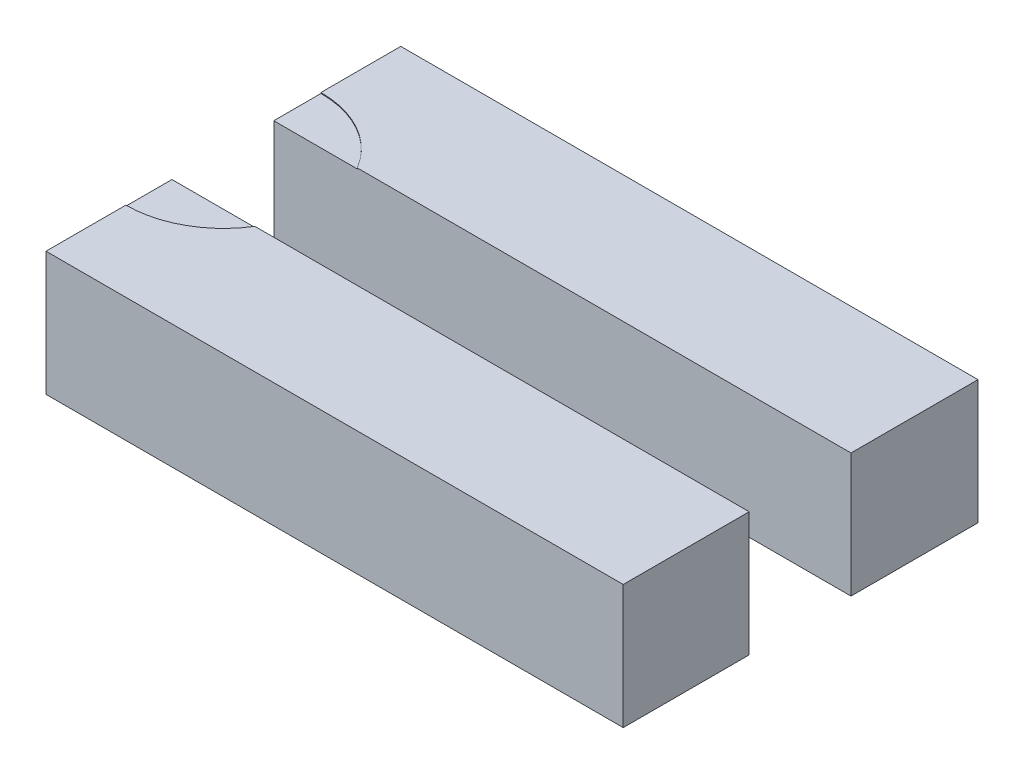
ISO-10303-21;
HEADER;
FILE_DESCRIPTION(('STEP AP214'),'2;1');
FILE_NAME('part.step','',(''),(''),'','','');
FILE_SCHEMA(('AUTOMOTIVE_DESIGN { 1 0 10303 214 1 1 1 1 }'));
ENDSEC;
DATA;
#1=APPLICATION_CONTEXT('core data for automotive mechanical design processes');
#2=APPLICATION_PROTOCOL_DEFINITION('international standard','automotive_design',2000,#1);
#3=PRODUCT_CONTEXT('',#1,'mechanical');
#4=PRODUCT('Part','Part','',(#3));
#5=PRODUCT_RELATED_PRODUCT_CATEGORY('part','',(#4));
#6=PRODUCT_DEFINITION_FORMATION('','',#4);
#7=PRODUCT_DEFINITION_CONTEXT('part definition',#1,'design');
#8=PRODUCT_DEFINITION('design','',#6,#7);
#9=PRODUCT_DEFINITION_SHAPE('','',#8);
#10=(LENGTH_UNIT() NAMED_UNIT(*) SI_UNIT(.MILLI.,.METRE.));
#11=(NAMED_UNIT(*) PLANE_ANGLE_UNIT() SI_UNIT($,.RADIAN.));
#12=(NAMED_UNIT(*) SI_UNIT($,.STERADIAN.) SOLID_ANGLE_UNIT());
#13=UNCERTAINTY_MEASURE_WITH_UNIT(LENGTH_MEASURE(1.E-05),#10,'distance_accuracy_value','');
#14=(GEOMETRIC_REPRESENTATION_CONTEXT(3) GLOBAL_UNCERTAINTY_ASSIGNED_CONTEXT((#13)) GLOBAL_UNIT_ASSIGNED_CONTEXT((#10,
#11,#12)) REPRESENTATION_CONTEXT('',''));
#15=CARTESIAN_POINT('',(0.,0.,0.));
#16=DIRECTION('',(0.,0.,1.));
#17=DIRECTION('',(1.,0.,0.));
#18=AXIS2_PLACEMENT_3D('',#15,#16,#17);
#19=CARTESIAN_POINT('',(-41.3258,9.5758,-12.7));
#20=DIRECTION('',(0.,0.,1.));
#21=DIRECTION('',(1.,0.,0.));
#22=AXIS2_PLACEMENT_3D('',#19,#20,#21);
#23=PLANE('',#22);
#24=DIRECTION('',(0.,-1.,0.));
#25=VECTOR('',#24,1.);
#26=CARTESIAN_POINT('',(0.,9.5758,-12.7));
#27=LINE('',#26,#25);
#28=CARTESIAN_POINT('',(0.,8.8773,-12.7));
#29=VERTEX_POINT('',#28);
#30=CARTESIAN_POINT('',(0.,0.,-12.7));
#31=VERTEX_POINT('',#30);
#32=EDGE_CURVE('E12',#29,#31,#27,.T.);
#33=ORIENTED_EDGE('',*,*,#32,.F.);
#34=DIRECTION('',(-1.,0.,0.));
#35=VECTOR('',#34,1.);
#36=CARTESIAN_POINT('',(-41.3258,8.8773,-12.7));
#37=LINE('',#36,#35);
#38=CARTESIAN_POINT('',(41.3258,8.8773,-12.7));
#39=VERTEX_POINT('',#38);
#40=EDGE_CURVE('E105',#39,#29,#37,.T.);
#41=ORIENTED_EDGE('',*,*,#40,.F.);
#42=DIRECTION('',(0.,-1.,0.));
#43=VECTOR('',#42,1.);
#44=CARTESIAN_POINT('',(41.3258,9.5758,-12.7));
#45=LINE('',#44,#43);
#46=CARTESIAN_POINT('',(41.3258,0.,-12.7));
#47=VERTEX_POINT('',#46);
#48=EDGE_CURVE('E117',#39,#47,#45,.T.);
#49=ORIENTED_EDGE('',*,*,#48,.T.);
#50=DIRECTION('',(-1.,0.,0.));
#51=VECTOR('',#50,1.);
#52=CARTESIAN_POINT('',(-41.3258,0.,-12.7));
#53=LINE('',#52,#51);
#54=EDGE_CURVE('E126',#47,#31,#53,.T.);
#55=ORIENTED_EDGE('',*,*,#54,.T.);
#56=EDGE_LOOP('',(#33,#41,#49,#55));
#57=FACE_BOUND('',#56,.T.);
#58=ADVANCED_FACE('F45',(#57),#23,.F.);
#59=CARTESIAN_POINT('',(0.,8.81379999999999,0.));
#60=DIRECTION('',(0.,1.,0.));
#61=DIRECTION('',(0.,0.,1.));
#62=AXIS2_PLACEMENT_3D('',#59,#60,#61);
#63=CYLINDRICAL_SURFACE('',#62,6.985);
#64=DIRECTION('',(0.,1.,0.));
#65=VECTOR('',#64,1.);
#66=CARTESIAN_POINT('',(0.,8.81379999999999,-6.985));
#67=LINE('',#66,#65);
#68=CARTESIAN_POINT('',(0.,8.81379999999999,-6.985));
#69=VERTEX_POINT('',#68);
#70=CARTESIAN_POINT('',(0.,8.8773,-6.985));
#71=VERTEX_POINT('',#70);
#72=EDGE_CURVE('E55',#69,#71,#67,.T.);
#73=ORIENTED_EDGE('',*,*,#72,.F.);
#74=CARTESIAN_POINT('',(0.,8.81379999999999,0.));
#75=DIRECTION('',(0.,1.,0.));
#76=DIRECTION('',(0.,0.,1.));
#77=AXIS2_PLACEMENT_3D('',#74,#75,#76);
#78=CIRCLE('',#77,6.985);
#79=CARTESIAN_POINT('',(5.98174044572314,8.81379999999999,-3.6068));
#80=VERTEX_POINT('',#79);
#81=EDGE_CURVE('E143',#80,#69,#78,.T.);
#82=ORIENTED_EDGE('',*,*,#81,.F.);
#83=DIRECTION('',(0.,1.,0.));
#84=VECTOR('',#83,1.);
#85=CARTESIAN_POINT('',(5.98174044572314,8.81379999999999,-3.6068));
#86=LINE('',#85,#84);
#87=CARTESIAN_POINT('',(5.98174044572314,8.8773,-3.6068));
#88=VERTEX_POINT('',#87);
#89=EDGE_CURVE('E111',#88,#80,#86,.F.);
#90=ORIENTED_EDGE('',*,*,#89,.F.);
#91=CARTESIAN_POINT('',(0.,8.8773,0.));
#92=DIRECTION('',(0.,1.,0.));
#93=DIRECTION('',(0.,0.,1.));
#94=AXIS2_PLACEMENT_3D('',#91,#92,#93);
#95=CIRCLE('',#94,6.985);
#96=EDGE_CURVE('E137',#71,#88,#95,.F.);
#97=ORIENTED_EDGE('',*,*,#96,.F.);
#98=EDGE_LOOP('',(#73,#82,#90,#97));
#99=FACE_BOUND('',#98,.T.);
#100=ADVANCED_FACE('F153',(#99),#63,.F.);
#101=CARTESIAN_POINT('',(0.,0.,0.));
#102=DIRECTION('',(0.,-1.,0.));
#103=DIRECTION('',(0.,0.,-1.));
#104=AXIS2_PLACEMENT_3D('',#101,#102,#103);
#105=PLANE('',#104);
#106=DIRECTION('',(-1.,0.,0.));
#107=VECTOR('',#106,1.);
#108=CARTESIAN_POINT('',(-9.47420000000001,0.,-3.6068));
#109=LINE('',#108,#107);
#110=CARTESIAN_POINT('',(41.3258,0.,-3.6068));
#111=VERTEX_POINT('',#110);
#112=CARTESIAN_POINT('',(0.,0.,-3.6068));
#113=VERTEX_POINT('',#112);
#114=EDGE_CURVE('E87',#111,#113,#109,.T.);
#115=ORIENTED_EDGE('',*,*,#114,.T.);
#116=DIRECTION('',(0.,0.,-1.));
#117=VECTOR('',#116,1.);
#118=CARTESIAN_POINT('',(0.,0.,0.));
#119=LINE('',#118,#117);
#120=EDGE_CURVE('E63',#113,#31,#119,.T.);
#121=ORIENTED_EDGE('',*,*,#120,.T.);
#122=ORIENTED_EDGE('',*,*,#54,.F.);
#123=DIRECTION('',(0.,0.,-1.));
#124=VECTOR('',#123,1.);
#125=CARTESIAN_POINT('',(41.3258,0.,12.7));
#126=LINE('',#125,#124);
#127=EDGE_CURVE('E124',#111,#47,#126,.T.);
#128=ORIENTED_EDGE('',*,*,#127,.F.);
#129=EDGE_LOOP('',(#115,#121,#122,#128));
#130=FACE_BOUND('',#129,.T.);
#131=ADVANCED_FACE('F146',(#130),#105,.T.);
#132=CARTESIAN_POINT('',(0.,8.81379999999999,0.));
#133=DIRECTION('',(0.,1.,0.));
#134=DIRECTION('',(0.,0.,1.));
#135=AXIS2_PLACEMENT_3D('',#132,#133,#134);
#136=PLANE('',#135);
#137=ORIENTED_EDGE('',*,*,#81,.T.);
#138=DIRECTION('',(0.,0.,1.));
#139=VECTOR('',#138,1.);
#140=CARTESIAN_POINT('',(0.,8.81379999999999,0.));
#141=LINE('',#140,#139);
#142=CARTESIAN_POINT('',(0.,8.81379999999999,-3.6068));
#143=VERTEX_POINT('',#142);
#144=EDGE_CURVE('E49',#69,#143,#141,.T.);
#145=ORIENTED_EDGE('',*,*,#144,.T.);
#146=DIRECTION('',(1.,0.,0.));
#147=VECTOR('',#146,1.);
#148=CARTESIAN_POINT('',(-9.47420000000001,8.81379999999999,-3.6068));
#149=LINE('',#148,#147);
#150=EDGE_CURVE('E120',#143,#80,#149,.T.);
#151=ORIENTED_EDGE('',*,*,#150,.T.);
#152=EDGE_LOOP('',(#137,#145,#151));
#153=FACE_BOUND('',#152,.T.);
#154=ADVANCED_FACE('F155',(#153),#136,.T.);
#155=CARTESIAN_POINT('',(0.,8.8773,0.));
#156=DIRECTION('',(0.,1.,0.));
#157=DIRECTION('',(0.,0.,1.));
#158=AXIS2_PLACEMENT_3D('',#155,#156,#157);
#159=PLANE('',#158);
#160=ORIENTED_EDGE('',*,*,#40,.T.);
#161=DIRECTION('',(0.,0.,1.));
#162=VECTOR('',#161,1.);
#163=CARTESIAN_POINT('',(0.,8.8773,0.));
#164=LINE('',#163,#162);
#165=EDGE_CURVE('E119',#29,#71,#164,.T.);
#166=ORIENTED_EDGE('',*,*,#165,.T.);
#167=ORIENTED_EDGE('',*,*,#96,.T.);
#168=DIRECTION('',(1.,0.,0.));
#169=VECTOR('',#168,1.);
#170=CARTESIAN_POINT('',(-9.47420000000001,8.8773,-3.6068));
#171=LINE('',#170,#169);
#172=CARTESIAN_POINT('',(41.3258,8.8773,-3.60679999999999));
#173=VERTEX_POINT('',#172);
#174=EDGE_CURVE('E108',#88,#173,#171,.T.);
#175=ORIENTED_EDGE('',*,*,#174,.T.);
#176=DIRECTION('',(0.,0.,-1.));
#177=VECTOR('',#176,1.);
#178=CARTESIAN_POINT('',(41.3258,8.8773,12.7));
#179=LINE('',#178,#177);
#180=EDGE_CURVE('E101',#173,#39,#179,.T.);
#181=ORIENTED_EDGE('',*,*,#180,.T.);
#182=EDGE_LOOP('',(#160,#166,#167,#175,#181));
#183=FACE_BOUND('',#182,.T.);
#184=ADVANCED_FACE('F103',(#183),#159,.T.);
#185=CARTESIAN_POINT('',(-9.47420000000001,0.,-3.6068));
#186=DIRECTION('',(0.,0.,-1.));
#187=DIRECTION('',(-1.,0.,0.));
#188=AXIS2_PLACEMENT_3D('',#185,#186,#187);
#189=PLANE('',#188);
#190=ORIENTED_EDGE('',*,*,#174,.F.);
#191=ORIENTED_EDGE('',*,*,#89,.T.);
#192=ORIENTED_EDGE('',*,*,#150,.F.);
#193=DIRECTION('',(0.,-1.,0.));
#194=VECTOR('',#193,1.);
#195=CARTESIAN_POINT('',(0.,0.,-3.6068));
#196=LINE('',#195,#194);
#197=EDGE_CURVE('E80',#143,#113,#196,.T.);
#198=ORIENTED_EDGE('',*,*,#197,.T.);
#199=ORIENTED_EDGE('',*,*,#114,.F.);
#200=DIRECTION('',(0.,1.,0.));
#201=VECTOR('',#200,1.);
#202=CARTESIAN_POINT('',(41.3258,0.,-3.6068));
#203=LINE('',#202,#201);
#204=EDGE_CURVE('E130',#111,#173,#203,.T.);
#205=ORIENTED_EDGE('',*,*,#204,.T.);
#206=EDGE_LOOP('',(#190,#191,#192,#198,#199,#205));
#207=FACE_BOUND('',#206,.T.);
#208=ADVANCED_FACE('F150',(#207),#189,.F.);
#209=CARTESIAN_POINT('',(41.3258,9.5758,12.7));
#210=DIRECTION('',(-1.,0.,0.));
#211=DIRECTION('',(0.,0.,1.));
#212=AXIS2_PLACEMENT_3D('',#209,#210,#211);
#213=PLANE('',#212);
#214=ORIENTED_EDGE('',*,*,#180,.F.);
#215=ORIENTED_EDGE('',*,*,#204,.F.);
#216=ORIENTED_EDGE('',*,*,#127,.T.);
#217=ORIENTED_EDGE('',*,*,#48,.F.);
#218=EDGE_LOOP('',(#214,#215,#216,#217));
#219=FACE_BOUND('',#218,.T.);
#220=ADVANCED_FACE('F122',(#219),#213,.F.);
#221=CARTESIAN_POINT('',(0.,0.,0.));
#222=DIRECTION('',(-1.,0.,0.));
#223=DIRECTION('',(0.,0.,1.));
#224=AXIS2_PLACEMENT_3D('',#221,#222,#223);
#225=PLANE('',#224);
#226=ORIENTED_EDGE('',*,*,#197,.F.);
#227=ORIENTED_EDGE('',*,*,#144,.F.);
#228=ORIENTED_EDGE('',*,*,#72,.T.);
#229=ORIENTED_EDGE('',*,*,#165,.F.);
#230=ORIENTED_EDGE('',*,*,#32,.T.);
#231=ORIENTED_EDGE('',*,*,#120,.F.);
#232=EDGE_LOOP('',(#226,#227,#228,#229,#230,#231));
#233=FACE_BOUND('',#232,.T.);
#234=ADVANCED_FACE('F47',(#233),#225,.T.);
#235=CLOSED_SHELL('',(#58,#100,#131,#154,#184,#208,#220,#234));
#236=MANIFOLD_SOLID_BREP('B2',#235);
#237=CARTESIAN_POINT('',(41.3258,9.5758,12.7));
#238=DIRECTION('',(-1.,0.,0.));
#239=DIRECTION('',(0.,0.,1.));
#240=AXIS2_PLACEMENT_3D('',#237,#238,#239);
#241=PLANE('',#240);
#242=DIRECTION('',(0.,0.,-1.));
#243=VECTOR('',#242,1.);
#244=CARTESIAN_POINT('',(41.3258,8.8773,12.7));
#245=LINE('',#244,#243);
#246=CARTESIAN_POINT('',(41.3258,8.8773,12.7));
#247=VERTEX_POINT('',#246);
#248=CARTESIAN_POINT('',(41.3258,8.8773,3.683));
#249=VERTEX_POINT('',#248);
#250=EDGE_CURVE('E314',#247,#249,#245,.T.);
#251=ORIENTED_EDGE('',*,*,#250,.F.);
#252=DIRECTION('',(0.,-1.,0.));
#253=VECTOR('',#252,1.);
#254=CARTESIAN_POINT('',(41.3258,9.5758,12.7));
#255=LINE('',#254,#253);
#256=CARTESIAN_POINT('',(41.3258,0.,12.7));
#257=VERTEX_POINT('',#256);
#258=EDGE_CURVE('E291',#247,#257,#255,.T.);
#259=ORIENTED_EDGE('',*,*,#258,.T.);
#260=DIRECTION('',(0.,0.,-1.));
#261=VECTOR('',#260,1.);
#262=CARTESIAN_POINT('',(41.3258,0.,12.7));
#263=LINE('',#262,#261);
#264=CARTESIAN_POINT('',(41.3258,0.,3.683));
#265=VERTEX_POINT('',#264);
#266=EDGE_CURVE('E298',#257,#265,#263,.T.);
#267=ORIENTED_EDGE('',*,*,#266,.T.);
#268=DIRECTION('',(0.,1.,0.));
#269=VECTOR('',#268,1.);
#270=CARTESIAN_POINT('',(41.3258,0.,3.683));
#271=LINE('',#270,#269);
#272=EDGE_CURVE('E301',#265,#249,#271,.T.);
#273=ORIENTED_EDGE('',*,*,#272,.T.);
#274=EDGE_LOOP('',(#251,#259,#267,#273));
#275=FACE_BOUND('',#274,.T.);
#276=ADVANCED_FACE('F227',(#275),#241,.F.);
#277=CARTESIAN_POINT('',(0.,8.81379999999999,0.));
#278=DIRECTION('',(0.,1.,0.));
#279=DIRECTION('',(0.,0.,1.));
#280=AXIS2_PLACEMENT_3D('',#277,#278,#279);
#281=PLANE('',#280);
#282=DIRECTION('',(-1.,0.,0.));
#283=VECTOR('',#282,1.);
#284=CARTESIAN_POINT('',(-9.47420000000001,8.81379999999999,3.683));
#285=LINE('',#284,#283);
#286=CARTESIAN_POINT('',(5.93512729433834,8.81379999999999,3.683));
#287=VERTEX_POINT('',#286);
#288=CARTESIAN_POINT('',(0.,8.81379999999999,3.683));
#289=VERTEX_POINT('',#288);
#290=EDGE_CURVE('E306',#287,#289,#285,.T.);
#291=ORIENTED_EDGE('',*,*,#290,.T.);
#292=DIRECTION('',(0.,0.,1.));
#293=VECTOR('',#292,1.);
#294=CARTESIAN_POINT('',(0.,8.81379999999999,0.));
#295=LINE('',#294,#293);
#296=CARTESIAN_POINT('',(0.,8.81379999999999,6.985));
#297=VERTEX_POINT('',#296);
#298=EDGE_CURVE('E320',#289,#297,#295,.T.);
#299=ORIENTED_EDGE('',*,*,#298,.T.);
#300=CARTESIAN_POINT('',(0.,8.81379999999999,0.));
#301=DIRECTION('',(0.,1.,0.));
#302=DIRECTION('',(0.,0.,1.));
#303=AXIS2_PLACEMENT_3D('',#300,#301,#302);
#304=CIRCLE('',#303,6.985);
#305=EDGE_CURVE('E286',#297,#287,#304,.T.);
#306=ORIENTED_EDGE('',*,*,#305,.T.);
#307=EDGE_LOOP('',(#291,#299,#306));
#308=FACE_BOUND('',#307,.T.);
#309=ADVANCED_FACE('F323',(#308),#281,.T.);
#310=CARTESIAN_POINT('',(0.,8.8773,0.));
#311=DIRECTION('',(0.,1.,0.));
#312=DIRECTION('',(0.,0.,1.));
#313=AXIS2_PLACEMENT_3D('',#310,#311,#312);
#314=PLANE('',#313);
#315=CARTESIAN_POINT('',(0.,8.8773,0.));
#316=DIRECTION('',(0.,1.,0.));
#317=DIRECTION('',(0.,0.,1.));
#318=AXIS2_PLACEMENT_3D('',#315,#316,#317);
#319=CIRCLE('',#318,6.985);
#320=CARTESIAN_POINT('',(5.93512729433834,8.8773,3.683));
#321=VERTEX_POINT('',#320);
#322=CARTESIAN_POINT('',(0.,8.8773,6.985));
#323=VERTEX_POINT('',#322);
#324=EDGE_CURVE('E234',#321,#323,#319,.F.);
#325=ORIENTED_EDGE('',*,*,#324,.T.);
#326=DIRECTION('',(0.,0.,1.));
#327=VECTOR('',#326,1.);
#328=CARTESIAN_POINT('',(0.,8.8773,0.));
#329=LINE('',#328,#327);
#330=CARTESIAN_POINT('',(0.,8.8773,12.7));
#331=VERTEX_POINT('',#330);
#332=EDGE_CURVE('E43',#323,#331,#329,.T.);
#333=ORIENTED_EDGE('',*,*,#332,.T.);
#334=DIRECTION('',(1.,0.,0.));
#335=VECTOR('',#334,1.);
#336=CARTESIAN_POINT('',(-41.3258,8.8773,12.7));
#337=LINE('',#336,#335);
#338=EDGE_CURVE('E312',#331,#247,#337,.T.);
#339=ORIENTED_EDGE('',*,*,#338,.T.);
#340=ORIENTED_EDGE('',*,*,#250,.T.);
#341=DIRECTION('',(-1.,0.,0.));
#342=VECTOR('',#341,1.);
#343=CARTESIAN_POINT('',(-9.47420000000001,8.8773,3.683));
#344=LINE('',#343,#342);
#345=EDGE_CURVE('E248',#249,#321,#344,.T.);
#346=ORIENTED_EDGE('',*,*,#345,.T.);
#347=EDGE_LOOP('',(#325,#333,#339,#340,#346));
#348=FACE_BOUND('',#347,.T.);
#349=ADVANCED_FACE('F288',(#348),#314,.T.);
#350=CARTESIAN_POINT('',(0.,8.81379999999999,0.));
#351=DIRECTION('',(0.,1.,0.));
#352=DIRECTION('',(0.,0.,1.));
#353=AXIS2_PLACEMENT_3D('',#350,#351,#352);
#354=CYLINDRICAL_SURFACE('',#353,6.985);
#355=DIRECTION('',(0.,1.,0.));
#356=VECTOR('',#355,1.);
#357=CARTESIAN_POINT('',(0.,8.81379999999999,6.985));
#358=LINE('',#357,#356);
#359=EDGE_CURVE('E278',#323,#297,#358,.F.);
#360=ORIENTED_EDGE('',*,*,#359,.F.);
#361=ORIENTED_EDGE('',*,*,#324,.F.);
#362=DIRECTION('',(0.,1.,0.));
#363=VECTOR('',#362,1.);
#364=CARTESIAN_POINT('',(5.93512729433834,8.81379999999999,3.683));
#365=LINE('',#364,#363);
#366=EDGE_CURVE('E309',#287,#321,#365,.T.);
#367=ORIENTED_EDGE('',*,*,#366,.F.);
#368=ORIENTED_EDGE('',*,*,#305,.F.);
#369=EDGE_LOOP('',(#360,#361,#367,#368));
#370=FACE_BOUND('',#369,.T.);
#371=ADVANCED_FACE('F283',(#370),#354,.F.);
#372=CARTESIAN_POINT('',(0.,0.,0.));
#373=DIRECTION('',(0.,-1.,0.));
#374=DIRECTION('',(0.,0.,-1.));
#375=AXIS2_PLACEMENT_3D('',#372,#373,#374);
#376=PLANE('',#375);
#377=DIRECTION('',(1.,0.,0.));
#378=VECTOR('',#377,1.);
#379=CARTESIAN_POINT('',(-41.3258,0.,12.7));
#380=LINE('',#379,#378);
#381=CARTESIAN_POINT('',(0.,0.,12.7));
#382=VERTEX_POINT('',#381);
#383=EDGE_CURVE('E296',#382,#257,#380,.T.);
#384=ORIENTED_EDGE('',*,*,#383,.F.);
#385=DIRECTION('',(0.,0.,-1.));
#386=VECTOR('',#385,1.);
#387=CARTESIAN_POINT('',(0.,0.,0.));
#388=LINE('',#387,#386);
#389=CARTESIAN_POINT('',(0.,0.,3.683));
#390=VERTEX_POINT('',#389);
#391=EDGE_CURVE('E317',#382,#390,#388,.T.);
#392=ORIENTED_EDGE('',*,*,#391,.T.);
#393=DIRECTION('',(1.,0.,0.));
#394=VECTOR('',#393,1.);
#395=CARTESIAN_POINT('',(-9.47420000000001,0.,3.683));
#396=LINE('',#395,#394);
#397=EDGE_CURVE('E304',#390,#265,#396,.T.);
#398=ORIENTED_EDGE('',*,*,#397,.T.);
#399=ORIENTED_EDGE('',*,*,#266,.F.);
#400=EDGE_LOOP('',(#384,#392,#398,#399));
#401=FACE_BOUND('',#400,.T.);
#402=ADVANCED_FACE('F329',(#401),#376,.T.);
#403=CARTESIAN_POINT('',(-41.3258,9.5758,12.7));
#404=DIRECTION('',(0.,0.,-1.));
#405=DIRECTION('',(-1.,0.,0.));
#406=AXIS2_PLACEMENT_3D('',#403,#404,#405);
#407=PLANE('',#406);
#408=DIRECTION('',(0.,1.,0.));
#409=VECTOR('',#408,1.);
#410=CARTESIAN_POINT('',(0.,9.5758,12.7));
#411=LINE('',#410,#409);
#412=EDGE_CURVE('E241',#382,#331,#411,.T.);
#413=ORIENTED_EDGE('',*,*,#412,.F.);
#414=ORIENTED_EDGE('',*,*,#383,.T.);
#415=ORIENTED_EDGE('',*,*,#258,.F.);
#416=ORIENTED_EDGE('',*,*,#338,.F.);
#417=EDGE_LOOP('',(#413,#414,#415,#416));
#418=FACE_BOUND('',#417,.T.);
#419=ADVANCED_FACE('F337',(#418),#407,.F.);
#420=CARTESIAN_POINT('',(-9.47420000000001,0.,3.683));
#421=DIRECTION('',(0.,0.,1.));
#422=DIRECTION('',(1.,0.,0.));
#423=AXIS2_PLACEMENT_3D('',#420,#421,#422);
#424=PLANE('',#423);
#425=ORIENTED_EDGE('',*,*,#345,.F.);
#426=ORIENTED_EDGE('',*,*,#272,.F.);
#427=ORIENTED_EDGE('',*,*,#397,.F.);
#428=DIRECTION('',(0.,1.,0.));
#429=VECTOR('',#428,1.);
#430=CARTESIAN_POINT('',(0.,0.,3.683));
#431=LINE('',#430,#429);
#432=EDGE_CURVE('E289',#390,#289,#431,.T.);
#433=ORIENTED_EDGE('',*,*,#432,.T.);
#434=ORIENTED_EDGE('',*,*,#290,.F.);
#435=ORIENTED_EDGE('',*,*,#366,.T.);
#436=EDGE_LOOP('',(#425,#426,#427,#433,#434,#435));
#437=FACE_BOUND('',#436,.T.);
#438=ADVANCED_FACE('F332',(#437),#424,.F.);
#439=CARTESIAN_POINT('',(0.,0.,0.));
#440=DIRECTION('',(-1.,0.,0.));
#441=DIRECTION('',(0.,0.,1.));
#442=AXIS2_PLACEMENT_3D('',#439,#440,#441);
#443=PLANE('',#442);
#444=ORIENTED_EDGE('',*,*,#432,.F.);
#445=ORIENTED_EDGE('',*,*,#391,.F.);
#446=ORIENTED_EDGE('',*,*,#412,.T.);
#447=ORIENTED_EDGE('',*,*,#332,.F.);
#448=ORIENTED_EDGE('',*,*,#359,.T.);
#449=ORIENTED_EDGE('',*,*,#298,.F.);
#450=EDGE_LOOP('',(#444,#445,#446,#447,#448,#449));
#451=FACE_BOUND('',#450,.T.);
#452=ADVANCED_FACE('F277',(#451),#443,.T.);
#453=CLOSED_SHELL('',(#276,#309,#349,#371,#402,#419,#438,#452));
#454=MANIFOLD_SOLID_BREP('B6',#453);
#455=ADVANCED_BREP_SHAPE_REPRESENTATION('',(#18,#236,#454),#14);
#456=SHAPE_DEFINITION_REPRESENTATION(#9,#455);
ENDSEC;
END-ISO-10303-21;
